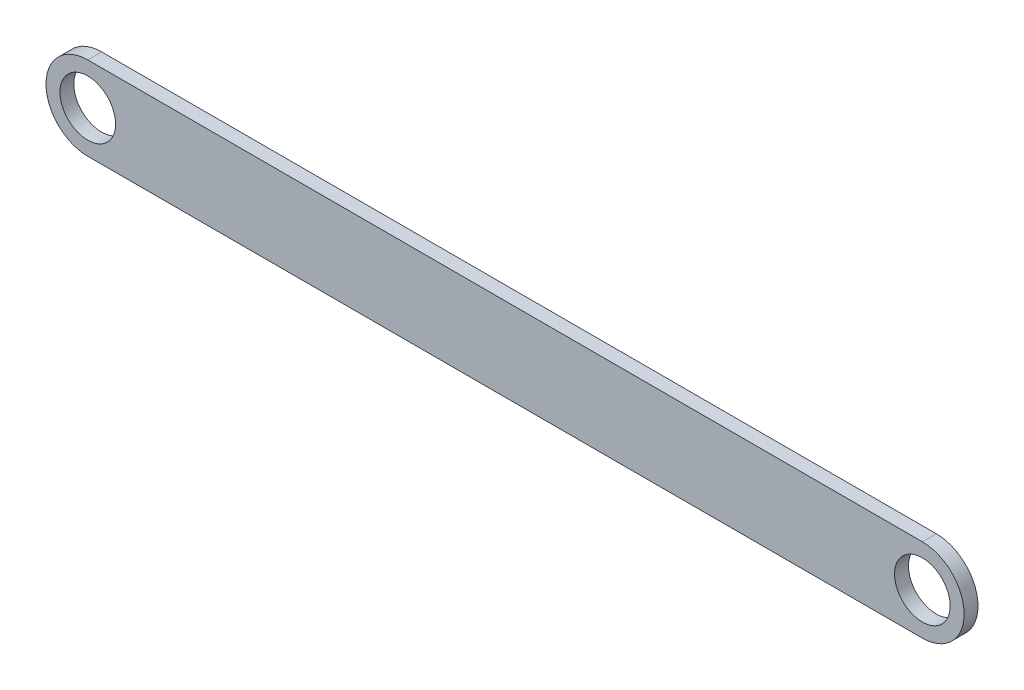
ISO-10303-21;
HEADER;
FILE_DESCRIPTION(('STEP AP214'),'2;1');
FILE_NAME('part.step','',(''),(''),'','','');
FILE_SCHEMA(('AUTOMOTIVE_DESIGN { 1 0 10303 214 1 1 1 1 }'));
ENDSEC;
DATA;
#1=APPLICATION_CONTEXT('core data for automotive mechanical design processes');
#2=APPLICATION_PROTOCOL_DEFINITION('international standard','automotive_design',2000,#1);
#3=PRODUCT_CONTEXT('',#1,'mechanical');
#4=PRODUCT('Part','Part','',(#3));
#5=PRODUCT_RELATED_PRODUCT_CATEGORY('part','',(#4));
#6=PRODUCT_DEFINITION_FORMATION('','',#4);
#7=PRODUCT_DEFINITION_CONTEXT('part definition',#1,'design');
#8=PRODUCT_DEFINITION('design','',#6,#7);
#9=PRODUCT_DEFINITION_SHAPE('','',#8);
#10=(LENGTH_UNIT() NAMED_UNIT(*) SI_UNIT(.MILLI.,.METRE.));
#11=(NAMED_UNIT(*) PLANE_ANGLE_UNIT() SI_UNIT($,.RADIAN.));
#12=(NAMED_UNIT(*) SI_UNIT($,.STERADIAN.) SOLID_ANGLE_UNIT());
#13=UNCERTAINTY_MEASURE_WITH_UNIT(LENGTH_MEASURE(1.E-05),#10,'distance_accuracy_value','');
#14=(GEOMETRIC_REPRESENTATION_CONTEXT(3) GLOBAL_UNCERTAINTY_ASSIGNED_CONTEXT((#13)) GLOBAL_UNIT_ASSIGNED_CONTEXT((#10,
#11,#12)) REPRESENTATION_CONTEXT('',''));
#15=CARTESIAN_POINT('',(0.,0.,0.));
#16=DIRECTION('',(0.,0.,1.));
#17=DIRECTION('',(1.,0.,0.));
#18=AXIS2_PLACEMENT_3D('',#15,#16,#17);
#19=CARTESIAN_POINT('',(0.,0.,50.));
#20=DIRECTION('',(0.,0.,1.));
#21=DIRECTION('',(1.,0.,0.));
#22=AXIS2_PLACEMENT_3D('',#19,#20,#21);
#23=PLANE('',#22);
#24=CARTESIAN_POINT('',(0.,0.,50.));
#25=DIRECTION('',(0.,0.,1.));
#26=DIRECTION('',(1.,0.,0.));
#27=AXIS2_PLACEMENT_3D('',#24,#25,#26);
#28=CIRCLE('',#27,100.);
#29=CARTESIAN_POINT('',(100.,0.,50.));
#30=VERTEX_POINT('',#29);
#31=EDGE_CURVE('E112',#30,#30,#28,.T.);
#32=ORIENTED_EDGE('',*,*,#31,.F.);
#33=EDGE_LOOP('',(#32));
#34=FACE_BOUND('',#33,.T.);
#35=CARTESIAN_POINT('',(0.,0.,50.));
#36=DIRECTION('',(0.,0.,1.));
#37=DIRECTION('',(1.,0.,0.));
#38=AXIS2_PLACEMENT_3D('',#35,#36,#37);
#39=CIRCLE('',#38,150.);
#40=CARTESIAN_POINT('',(0.,150.,50.));
#41=VERTEX_POINT('',#40);
#42=CARTESIAN_POINT('',(0.,-150.,50.));
#43=VERTEX_POINT('',#42);
#44=EDGE_CURVE('E92',#41,#43,#39,.T.);
#45=ORIENTED_EDGE('',*,*,#44,.T.);
#46=DIRECTION('',(1.,0.,0.));
#47=VECTOR('',#46,1.);
#48=CARTESIAN_POINT('',(0.,-150.,50.));
#49=LINE('',#48,#47);
#50=CARTESIAN_POINT('',(3000.,-150.,50.));
#51=VERTEX_POINT('',#50);
#52=EDGE_CURVE('E87',#43,#51,#49,.T.);
#53=ORIENTED_EDGE('',*,*,#52,.T.);
#54=CARTESIAN_POINT('',(3000.,0.,50.));
#55=DIRECTION('',(0.,0.,1.));
#56=DIRECTION('',(1.,0.,0.));
#57=AXIS2_PLACEMENT_3D('',#54,#55,#56);
#58=CIRCLE('',#57,150.);
#59=CARTESIAN_POINT('',(3000.,150.,50.));
#60=VERTEX_POINT('',#59);
#61=EDGE_CURVE('E90',#51,#60,#58,.T.);
#62=ORIENTED_EDGE('',*,*,#61,.T.);
#63=DIRECTION('',(-1.,0.,0.));
#64=VECTOR('',#63,1.);
#65=CARTESIAN_POINT('',(0.,150.,50.));
#66=LINE('',#65,#64);
#67=EDGE_CURVE('E57',#60,#41,#66,.T.);
#68=ORIENTED_EDGE('',*,*,#67,.T.);
#69=EDGE_LOOP('',(#45,#53,#62,#68));
#70=FACE_BOUND('',#69,.T.);
#71=CARTESIAN_POINT('',(3000.,0.,50.));
#72=DIRECTION('',(0.,0.,1.));
#73=DIRECTION('',(1.,0.,0.));
#74=AXIS2_PLACEMENT_3D('',#71,#72,#73);
#75=CIRCLE('',#74,100.);
#76=CARTESIAN_POINT('',(3100.,0.,50.));
#77=VERTEX_POINT('',#76);
#78=EDGE_CURVE('E134',#77,#77,#75,.T.);
#79=ORIENTED_EDGE('',*,*,#78,.F.);
#80=EDGE_LOOP('',(#79));
#81=FACE_BOUND('',#80,.T.);
#82=ADVANCED_FACE('F39',(#34,#70,#81),#23,.T.);
#83=CARTESIAN_POINT('',(0.,0.,0.));
#84=DIRECTION('',(0.,0.,1.));
#85=DIRECTION('',(1.,0.,0.));
#86=AXIS2_PLACEMENT_3D('',#83,#84,#85);
#87=PLANE('',#86);
#88=CARTESIAN_POINT('',(0.,0.,0.));
#89=DIRECTION('',(0.,0.,1.));
#90=DIRECTION('',(1.,0.,0.));
#91=AXIS2_PLACEMENT_3D('',#88,#89,#90);
#92=CIRCLE('',#91,150.);
#93=CARTESIAN_POINT('',(0.,150.,0.));
#94=VERTEX_POINT('',#93);
#95=CARTESIAN_POINT('',(0.,-150.,0.));
#96=VERTEX_POINT('',#95);
#97=EDGE_CURVE('E108',#94,#96,#92,.T.);
#98=ORIENTED_EDGE('',*,*,#97,.F.);
#99=DIRECTION('',(-1.,0.,0.));
#100=VECTOR('',#99,1.);
#101=CARTESIAN_POINT('',(0.,150.,0.));
#102=LINE('',#101,#100);
#103=CARTESIAN_POINT('',(3000.,150.,0.));
#104=VERTEX_POINT('',#103);
#105=EDGE_CURVE('E80',#104,#94,#102,.T.);
#106=ORIENTED_EDGE('',*,*,#105,.F.);
#107=CARTESIAN_POINT('',(3000.,0.,0.));
#108=DIRECTION('',(0.,0.,1.));
#109=DIRECTION('',(1.,0.,0.));
#110=AXIS2_PLACEMENT_3D('',#107,#108,#109);
#111=CIRCLE('',#110,150.);
#112=CARTESIAN_POINT('',(3000.,-150.,0.));
#113=VERTEX_POINT('',#112);
#114=EDGE_CURVE('E74',#113,#104,#111,.T.);
#115=ORIENTED_EDGE('',*,*,#114,.F.);
#116=DIRECTION('',(1.,0.,0.));
#117=VECTOR('',#116,1.);
#118=CARTESIAN_POINT('',(0.,-150.,0.));
#119=LINE('',#118,#117);
#120=EDGE_CURVE('E97',#96,#113,#119,.T.);
#121=ORIENTED_EDGE('',*,*,#120,.F.);
#122=EDGE_LOOP('',(#98,#106,#115,#121));
#123=FACE_BOUND('',#122,.T.);
#124=CARTESIAN_POINT('',(0.,0.,0.));
#125=DIRECTION('',(0.,0.,1.));
#126=DIRECTION('',(1.,0.,0.));
#127=AXIS2_PLACEMENT_3D('',#124,#125,#126);
#128=CIRCLE('',#127,100.);
#129=CARTESIAN_POINT('',(100.,0.,0.));
#130=VERTEX_POINT('',#129);
#131=EDGE_CURVE('E130',#130,#130,#128,.T.);
#132=ORIENTED_EDGE('',*,*,#131,.T.);
#133=EDGE_LOOP('',(#132));
#134=FACE_BOUND('',#133,.T.);
#135=CARTESIAN_POINT('',(3000.,0.,0.));
#136=DIRECTION('',(0.,0.,1.));
#137=DIRECTION('',(1.,0.,0.));
#138=AXIS2_PLACEMENT_3D('',#135,#136,#137);
#139=CIRCLE('',#138,100.);
#140=CARTESIAN_POINT('',(3100.,0.,0.));
#141=VERTEX_POINT('',#140);
#142=EDGE_CURVE('E138',#141,#141,#139,.T.);
#143=ORIENTED_EDGE('',*,*,#142,.T.);
#144=EDGE_LOOP('',(#143));
#145=FACE_BOUND('',#144,.T.);
#146=ADVANCED_FACE('F125',(#123,#134,#145),#87,.F.);
#147=CARTESIAN_POINT('',(0.,0.,50.));
#148=DIRECTION('',(0.,0.,-1.));
#149=DIRECTION('',(-1.,0.,0.));
#150=AXIS2_PLACEMENT_3D('',#147,#148,#149);
#151=CYLINDRICAL_SURFACE('',#150,150.);
#152=ORIENTED_EDGE('',*,*,#97,.T.);
#153=DIRECTION('',(0.,0.,-1.));
#154=VECTOR('',#153,1.);
#155=CARTESIAN_POINT('',(0.,-150.,50.));
#156=LINE('',#155,#154);
#157=EDGE_CURVE('E11',#43,#96,#156,.T.);
#158=ORIENTED_EDGE('',*,*,#157,.F.);
#159=ORIENTED_EDGE('',*,*,#44,.F.);
#160=DIRECTION('',(0.,0.,-1.));
#161=VECTOR('',#160,1.);
#162=CARTESIAN_POINT('',(0.,150.,50.));
#163=LINE('',#162,#161);
#164=EDGE_CURVE('E104',#41,#94,#163,.T.);
#165=ORIENTED_EDGE('',*,*,#164,.T.);
#166=EDGE_LOOP('',(#152,#158,#159,#165));
#167=FACE_BOUND('',#166,.T.);
#168=ADVANCED_FACE('F41',(#167),#151,.T.);
#169=CARTESIAN_POINT('',(0.,-150.,50.));
#170=DIRECTION('',(0.,1.,0.));
#171=DIRECTION('',(0.,0.,1.));
#172=AXIS2_PLACEMENT_3D('',#169,#170,#171);
#173=PLANE('',#172);
#174=ORIENTED_EDGE('',*,*,#120,.T.);
#175=DIRECTION('',(0.,0.,-1.));
#176=VECTOR('',#175,1.);
#177=CARTESIAN_POINT('',(3000.,-150.,50.));
#178=LINE('',#177,#176);
#179=EDGE_CURVE('E49',#51,#113,#178,.T.);
#180=ORIENTED_EDGE('',*,*,#179,.F.);
#181=ORIENTED_EDGE('',*,*,#52,.F.);
#182=ORIENTED_EDGE('',*,*,#157,.T.);
#183=EDGE_LOOP('',(#174,#180,#181,#182));
#184=FACE_BOUND('',#183,.T.);
#185=ADVANCED_FACE('F96',(#184),#173,.F.);
#186=CARTESIAN_POINT('',(3000.,0.,50.));
#187=DIRECTION('',(0.,0.,-1.));
#188=DIRECTION('',(-1.,0.,0.));
#189=AXIS2_PLACEMENT_3D('',#186,#187,#188);
#190=CYLINDRICAL_SURFACE('',#189,150.);
#191=ORIENTED_EDGE('',*,*,#114,.T.);
#192=DIRECTION('',(0.,0.,-1.));
#193=VECTOR('',#192,1.);
#194=CARTESIAN_POINT('',(3000.,150.,50.));
#195=LINE('',#194,#193);
#196=EDGE_CURVE('E99',#60,#104,#195,.T.);
#197=ORIENTED_EDGE('',*,*,#196,.F.);
#198=ORIENTED_EDGE('',*,*,#61,.F.);
#199=ORIENTED_EDGE('',*,*,#179,.T.);
#200=EDGE_LOOP('',(#191,#197,#198,#199));
#201=FACE_BOUND('',#200,.T.);
#202=ADVANCED_FACE('F100',(#201),#190,.T.);
#203=CARTESIAN_POINT('',(0.,150.,50.));
#204=DIRECTION('',(0.,-1.,0.));
#205=DIRECTION('',(0.,0.,-1.));
#206=AXIS2_PLACEMENT_3D('',#203,#204,#205);
#207=PLANE('',#206);
#208=ORIENTED_EDGE('',*,*,#105,.T.);
#209=ORIENTED_EDGE('',*,*,#164,.F.);
#210=ORIENTED_EDGE('',*,*,#67,.F.);
#211=ORIENTED_EDGE('',*,*,#196,.T.);
#212=EDGE_LOOP('',(#208,#209,#210,#211));
#213=FACE_BOUND('',#212,.T.);
#214=ADVANCED_FACE('F122',(#213),#207,.F.);
#215=CARTESIAN_POINT('',(0.,0.,50.));
#216=DIRECTION('',(0.,0.,-1.));
#217=DIRECTION('',(-1.,0.,0.));
#218=AXIS2_PLACEMENT_3D('',#215,#216,#217);
#219=CYLINDRICAL_SURFACE('',#218,100.);
#220=ORIENTED_EDGE('',*,*,#31,.T.);
#221=EDGE_LOOP('',(#220));
#222=FACE_BOUND('',#221,.T.);
#223=ORIENTED_EDGE('',*,*,#131,.F.);
#224=EDGE_LOOP('',(#223));
#225=FACE_BOUND('',#224,.T.);
#226=ADVANCED_FACE('F157',(#222,#225),#219,.F.);
#227=CARTESIAN_POINT('',(3000.,0.,50.));
#228=DIRECTION('',(0.,0.,-1.));
#229=DIRECTION('',(-1.,0.,0.));
#230=AXIS2_PLACEMENT_3D('',#227,#228,#229);
#231=CYLINDRICAL_SURFACE('',#230,100.);
#232=ORIENTED_EDGE('',*,*,#78,.T.);
#233=EDGE_LOOP('',(#232));
#234=FACE_BOUND('',#233,.T.);
#235=ORIENTED_EDGE('',*,*,#142,.F.);
#236=EDGE_LOOP('',(#235));
#237=FACE_BOUND('',#236,.T.);
#238=ADVANCED_FACE('F146',(#234,#237),#231,.F.);
#239=CLOSED_SHELL('',(#82,#146,#168,#185,#202,#214,#226,#238));
#240=MANIFOLD_SOLID_BREP('B2',#239);
#241=ADVANCED_BREP_SHAPE_REPRESENTATION('',(#18,#240),#14);
#242=SHAPE_DEFINITION_REPRESENTATION(#9,#241);
ENDSEC;
END-ISO-10303-21;
